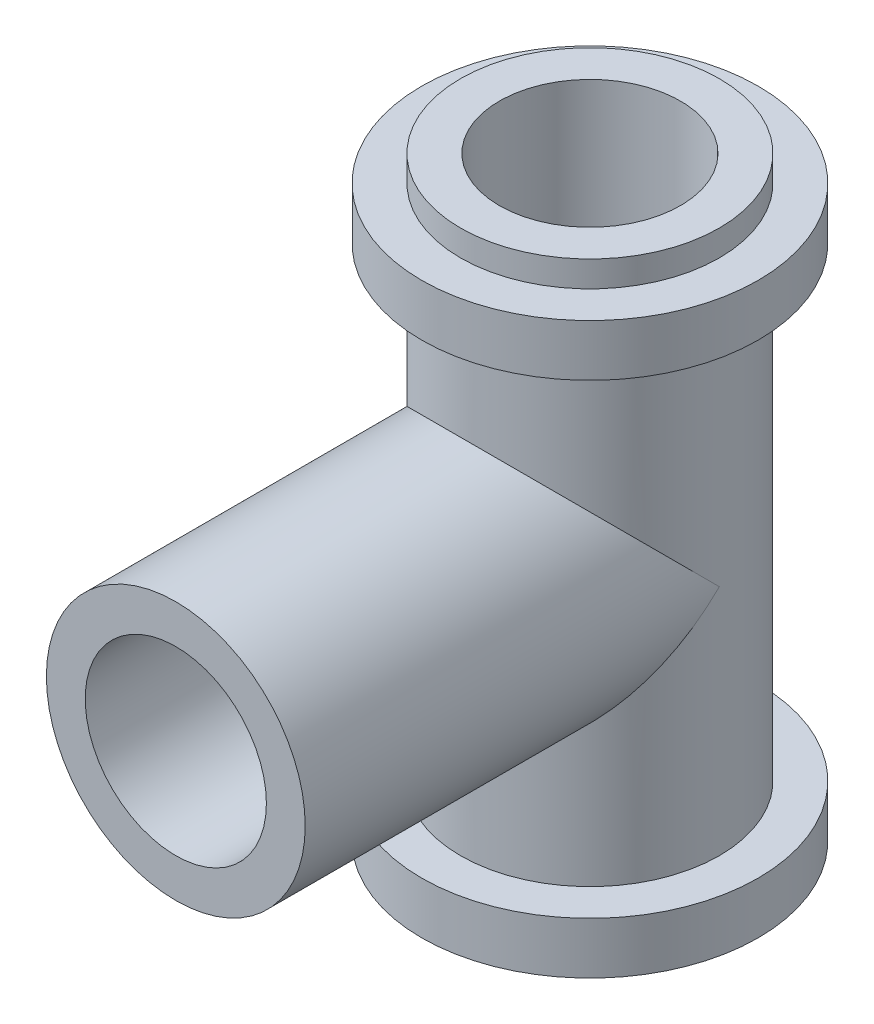
ISO-10303-21;
HEADER;
FILE_DESCRIPTION(('STEP AP214'),'2;1');
FILE_NAME('part.step','',(''),(''),'','','');
FILE_SCHEMA(('AUTOMOTIVE_DESIGN { 1 0 10303 214 1 1 1 1 }'));
ENDSEC;
DATA;
#1=APPLICATION_CONTEXT('core data for automotive mechanical design processes');
#2=APPLICATION_PROTOCOL_DEFINITION('international standard','automotive_design',2000,#1);
#3=PRODUCT_CONTEXT('',#1,'mechanical');
#4=PRODUCT('Part','Part','',(#3));
#5=PRODUCT_RELATED_PRODUCT_CATEGORY('part','',(#4));
#6=PRODUCT_DEFINITION_FORMATION('','',#4);
#7=PRODUCT_DEFINITION_CONTEXT('part definition',#1,'design');
#8=PRODUCT_DEFINITION('design','',#6,#7);
#9=PRODUCT_DEFINITION_SHAPE('','',#8);
#10=(LENGTH_UNIT() NAMED_UNIT(*) SI_UNIT(.MILLI.,.METRE.));
#11=(NAMED_UNIT(*) PLANE_ANGLE_UNIT() SI_UNIT($,.RADIAN.));
#12=(NAMED_UNIT(*) SI_UNIT($,.STERADIAN.) SOLID_ANGLE_UNIT());
#13=UNCERTAINTY_MEASURE_WITH_UNIT(LENGTH_MEASURE(1.E-05),#10,'distance_accuracy_value','');
#14=(GEOMETRIC_REPRESENTATION_CONTEXT(3) GLOBAL_UNCERTAINTY_ASSIGNED_CONTEXT((#13)) GLOBAL_UNIT_ASSIGNED_CONTEXT((#10,
#11,#12)) REPRESENTATION_CONTEXT('',''));
#15=CARTESIAN_POINT('',(0.,0.,0.));
#16=DIRECTION('',(0.,0.,1.));
#17=DIRECTION('',(1.,0.,0.));
#18=AXIS2_PLACEMENT_3D('',#15,#16,#17);
#19=CARTESIAN_POINT('',(0.,120.,0.));
#20=DIRECTION('',(0.,-1.,0.));
#21=DIRECTION('',(0.,0.,-1.));
#22=AXIS2_PLACEMENT_3D('',#19,#20,#21);
#23=CYLINDRICAL_SURFACE('',#22,25.);
#24=CARTESIAN_POINT('',(0.,60.,0.));
#25=DIRECTION('',(0.,-0.707106781186547,-0.707106781186547));
#26=DIRECTION('',(0.,-0.707106781186547,0.707106781186547));
#27=AXIS2_PLACEMENT_3D('',#24,#25,#26);
#28=ELLIPSE('',#27,35.3553390593274,25.);
#29=CARTESIAN_POINT('',(-25.,60.,0.));
#30=VERTEX_POINT('',#29);
#31=CARTESIAN_POINT('',(25.,60.,0.));
#32=VERTEX_POINT('',#31);
#33=EDGE_CURVE('E44',#30,#32,#28,.F.);
#34=ORIENTED_EDGE('',*,*,#33,.F.);
#35=CARTESIAN_POINT('',(0.,60.,0.));
#36=DIRECTION('',(0.,-0.707106781186547,0.707106781186547));
#37=DIRECTION('',(0.,-0.707106781186547,-0.707106781186547));
#38=AXIS2_PLACEMENT_3D('',#35,#36,#37);
#39=ELLIPSE('',#38,35.3553390593274,25.);
#40=EDGE_CURVE('E56',#32,#30,#39,.T.);
#41=ORIENTED_EDGE('',*,*,#40,.F.);
#42=EDGE_LOOP('',(#34,#41));
#43=FACE_BOUND('',#42,.T.);
#44=CARTESIAN_POINT('',(0.,15.,0.));
#45=DIRECTION('',(0.,-1.,0.));
#46=DIRECTION('',(0.,0.,-1.));
#47=AXIS2_PLACEMENT_3D('',#44,#45,#46);
#48=CIRCLE('',#47,25.);
#49=CARTESIAN_POINT('',(0.,15.,-25.));
#50=VERTEX_POINT('',#49);
#51=EDGE_CURVE('E49',#50,#50,#48,.T.);
#52=ORIENTED_EDGE('',*,*,#51,.F.);
#53=EDGE_LOOP('',(#52));
#54=FACE_BOUND('',#53,.T.);
#55=CARTESIAN_POINT('',(0.,105.,0.));
#56=DIRECTION('',(0.,1.,0.));
#57=DIRECTION('',(0.,0.,1.));
#58=AXIS2_PLACEMENT_3D('',#55,#56,#57);
#59=CIRCLE('',#58,25.);
#60=CARTESIAN_POINT('',(0.,105.,25.));
#61=VERTEX_POINT('',#60);
#62=EDGE_CURVE('E12',#61,#61,#59,.T.);
#63=ORIENTED_EDGE('',*,*,#62,.F.);
#64=EDGE_LOOP('',(#63));
#65=FACE_BOUND('',#64,.T.);
#66=ADVANCED_FACE('F40',(#43,#54,#65),#23,.T.);
#67=CARTESIAN_POINT('',(0.,60.,80.));
#68=DIRECTION('',(0.,0.,-1.));
#69=DIRECTION('',(-1.,0.,0.));
#70=AXIS2_PLACEMENT_3D('',#67,#68,#69);
#71=CYLINDRICAL_SURFACE('',#70,25.);
#72=CARTESIAN_POINT('',(0.,60.,80.));
#73=DIRECTION('',(0.,0.,1.));
#74=DIRECTION('',(1.,0.,0.));
#75=AXIS2_PLACEMENT_3D('',#72,#73,#74);
#76=CIRCLE('',#75,25.);
#77=CARTESIAN_POINT('',(25.,60.,80.));
#78=VERTEX_POINT('',#77);
#79=EDGE_CURVE('E71',#78,#78,#76,.T.);
#80=ORIENTED_EDGE('',*,*,#79,.F.);
#81=EDGE_LOOP('',(#80));
#82=FACE_BOUND('',#81,.T.);
#83=ORIENTED_EDGE('',*,*,#40,.T.);
#84=ORIENTED_EDGE('',*,*,#33,.T.);
#85=EDGE_LOOP('',(#83,#84));
#86=FACE_BOUND('',#85,.T.);
#87=ADVANCED_FACE('F140',(#82,#86),#71,.T.);
#88=CARTESIAN_POINT('',(0.,60.,80.));
#89=DIRECTION('',(0.,0.,1.));
#90=DIRECTION('',(1.,0.,0.));
#91=AXIS2_PLACEMENT_3D('',#88,#89,#90);
#92=PLANE('',#91);
#93=CARTESIAN_POINT('',(0.,60.,80.));
#94=DIRECTION('',(0.,0.,1.));
#95=DIRECTION('',(1.,0.,0.));
#96=AXIS2_PLACEMENT_3D('',#93,#94,#95);
#97=CIRCLE('',#96,17.5);
#98=CARTESIAN_POINT('',(17.5,60.,80.));
#99=VERTEX_POINT('',#98);
#100=EDGE_CURVE('E82',#99,#99,#97,.T.);
#101=ORIENTED_EDGE('',*,*,#100,.F.);
#102=EDGE_LOOP('',(#101));
#103=FACE_BOUND('',#102,.T.);
#104=ORIENTED_EDGE('',*,*,#79,.T.);
#105=EDGE_LOOP('',(#104));
#106=FACE_BOUND('',#105,.T.);
#107=ADVANCED_FACE('F144',(#103,#106),#92,.T.);
#108=CARTESIAN_POINT('',(0.,60.,80.));
#109=DIRECTION('',(0.,0.,-1.));
#110=DIRECTION('',(-1.,0.,0.));
#111=AXIS2_PLACEMENT_3D('',#108,#109,#110);
#112=CYLINDRICAL_SURFACE('',#111,17.5);
#113=ORIENTED_EDGE('',*,*,#100,.T.);
#114=EDGE_LOOP('',(#113));
#115=FACE_BOUND('',#114,.T.);
#116=CARTESIAN_POINT('',(0.,60.,0.));
#117=DIRECTION('',(0.,-0.707106781186547,0.707106781186547));
#118=DIRECTION('',(0.,-0.707106781186547,-0.707106781186547));
#119=AXIS2_PLACEMENT_3D('',#116,#117,#118);
#120=ELLIPSE('',#119,24.7487373415292,17.5);
#121=CARTESIAN_POINT('',(17.5,60.,0.));
#122=VERTEX_POINT('',#121);
#123=CARTESIAN_POINT('',(-17.5,60.,0.));
#124=VERTEX_POINT('',#123);
#125=EDGE_CURVE('E69',#122,#124,#120,.T.);
#126=ORIENTED_EDGE('',*,*,#125,.F.);
#127=CARTESIAN_POINT('',(0.,60.,0.));
#128=DIRECTION('',(0.,-0.707106781186547,-0.707106781186547));
#129=DIRECTION('',(0.,-0.707106781186547,0.707106781186547));
#130=AXIS2_PLACEMENT_3D('',#127,#128,#129);
#131=ELLIPSE('',#130,24.7487373415292,17.5);
#132=EDGE_CURVE('E66',#124,#122,#131,.F.);
#133=ORIENTED_EDGE('',*,*,#132,.F.);
#134=EDGE_LOOP('',(#126,#133));
#135=FACE_BOUND('',#134,.T.);
#136=ADVANCED_FACE('F68',(#115,#135),#112,.F.);
#137=CARTESIAN_POINT('',(0.,15.,0.));
#138=DIRECTION('',(0.,-1.,0.));
#139=DIRECTION('',(0.,0.,-1.));
#140=AXIS2_PLACEMENT_3D('',#137,#138,#139);
#141=CYLINDRICAL_SURFACE('',#140,32.5);
#142=CARTESIAN_POINT('',(0.,15.,0.));
#143=DIRECTION('',(0.,-1.,0.));
#144=DIRECTION('',(0.,0.,-1.));
#145=AXIS2_PLACEMENT_3D('',#142,#143,#144);
#146=CIRCLE('',#145,32.5);
#147=CARTESIAN_POINT('',(0.,15.,-32.5));
#148=VERTEX_POINT('',#147);
#149=EDGE_CURVE('E101',#148,#148,#146,.T.);
#150=ORIENTED_EDGE('',*,*,#149,.T.);
#151=EDGE_LOOP('',(#150));
#152=FACE_BOUND('',#151,.T.);
#153=CARTESIAN_POINT('',(0.,5.,0.));
#154=DIRECTION('',(0.,-1.,0.));
#155=DIRECTION('',(0.,0.,-1.));
#156=AXIS2_PLACEMENT_3D('',#153,#154,#155);
#157=CIRCLE('',#156,32.5);
#158=CARTESIAN_POINT('',(0.,5.,-32.5));
#159=VERTEX_POINT('',#158);
#160=EDGE_CURVE('E102',#159,#159,#157,.T.);
#161=ORIENTED_EDGE('',*,*,#160,.F.);
#162=EDGE_LOOP('',(#161));
#163=FACE_BOUND('',#162,.T.);
#164=ADVANCED_FACE('F167',(#152,#163),#141,.T.);
#165=CARTESIAN_POINT('',(0.,15.,0.));
#166=DIRECTION('',(0.,-1.,0.));
#167=DIRECTION('',(0.,0.,-1.));
#168=AXIS2_PLACEMENT_3D('',#165,#166,#167);
#169=PLANE('',#168);
#170=ORIENTED_EDGE('',*,*,#51,.T.);
#171=EDGE_LOOP('',(#170));
#172=FACE_BOUND('',#171,.T.);
#173=ORIENTED_EDGE('',*,*,#149,.F.);
#174=EDGE_LOOP('',(#173));
#175=FACE_BOUND('',#174,.T.);
#176=ADVANCED_FACE('F157',(#172,#175),#169,.F.);
#177=CARTESIAN_POINT('',(0.,5.,0.));
#178=DIRECTION('',(0.,-1.,0.));
#179=DIRECTION('',(0.,0.,-1.));
#180=AXIS2_PLACEMENT_3D('',#177,#178,#179);
#181=PLANE('',#180);
#182=CARTESIAN_POINT('',(0.,5.,0.));
#183=DIRECTION('',(0.,-1.,0.));
#184=DIRECTION('',(0.,0.,-1.));
#185=AXIS2_PLACEMENT_3D('',#182,#183,#184);
#186=CIRCLE('',#185,25.);
#187=CARTESIAN_POINT('',(0.,5.,-25.));
#188=VERTEX_POINT('',#187);
#189=EDGE_CURVE('E86',#188,#188,#186,.T.);
#190=ORIENTED_EDGE('',*,*,#189,.F.);
#191=EDGE_LOOP('',(#190));
#192=FACE_BOUND('',#191,.T.);
#193=ORIENTED_EDGE('',*,*,#160,.T.);
#194=EDGE_LOOP('',(#193));
#195=FACE_BOUND('',#194,.T.);
#196=ADVANCED_FACE('F150',(#192,#195),#181,.T.);
#197=ORIENTED_EDGE('',*,*,#189,.T.);
#198=EDGE_LOOP('',(#197));
#199=FACE_BOUND('',#198,.T.);
#200=CARTESIAN_POINT('',(0.,0.,0.));
#201=DIRECTION('',(0.,1.,0.));
#202=DIRECTION('',(0.,0.,1.));
#203=AXIS2_PLACEMENT_3D('',#200,#201,#202);
#204=CIRCLE('',#203,25.);
#205=CARTESIAN_POINT('',(0.,0.,25.));
#206=VERTEX_POINT('',#205);
#207=EDGE_CURVE('E89',#206,#206,#204,.T.);
#208=ORIENTED_EDGE('',*,*,#207,.T.);
#209=EDGE_LOOP('',(#208));
#210=FACE_BOUND('',#209,.T.);
#211=ADVANCED_FACE('F42',(#199,#210),#23,.T.);
#212=CARTESIAN_POINT('',(0.,0.,0.));
#213=DIRECTION('',(0.,1.,0.));
#214=DIRECTION('',(0.,0.,1.));
#215=AXIS2_PLACEMENT_3D('',#212,#213,#214);
#216=PLANE('',#215);
#217=CARTESIAN_POINT('',(0.,0.,0.));
#218=DIRECTION('',(0.,1.,0.));
#219=DIRECTION('',(0.,0.,1.));
#220=AXIS2_PLACEMENT_3D('',#217,#218,#219);
#221=CIRCLE('',#220,17.5);
#222=CARTESIAN_POINT('',(0.,0.,17.5));
#223=VERTEX_POINT('',#222);
#224=EDGE_CURVE('E77',#223,#223,#221,.T.);
#225=ORIENTED_EDGE('',*,*,#224,.T.);
#226=EDGE_LOOP('',(#225));
#227=FACE_BOUND('',#226,.T.);
#228=ORIENTED_EDGE('',*,*,#207,.F.);
#229=EDGE_LOOP('',(#228));
#230=FACE_BOUND('',#229,.T.);
#231=ADVANCED_FACE('F149',(#227,#230),#216,.F.);
#232=CARTESIAN_POINT('',(0.,120.,0.));
#233=DIRECTION('',(0.,-1.,0.));
#234=DIRECTION('',(0.,0.,-1.));
#235=AXIS2_PLACEMENT_3D('',#232,#233,#234);
#236=CYLINDRICAL_SURFACE('',#235,17.5);
#237=ORIENTED_EDGE('',*,*,#224,.F.);
#238=EDGE_LOOP('',(#237));
#239=FACE_BOUND('',#238,.T.);
#240=CARTESIAN_POINT('',(0.,120.,0.));
#241=DIRECTION('',(0.,1.,0.));
#242=DIRECTION('',(0.,0.,1.));
#243=AXIS2_PLACEMENT_3D('',#240,#241,#242);
#244=CIRCLE('',#243,17.5);
#245=CARTESIAN_POINT('',(0.,120.,17.5));
#246=VERTEX_POINT('',#245);
#247=EDGE_CURVE('E74',#246,#246,#244,.T.);
#248=ORIENTED_EDGE('',*,*,#247,.T.);
#249=EDGE_LOOP('',(#248));
#250=FACE_BOUND('',#249,.T.);
#251=ORIENTED_EDGE('',*,*,#132,.T.);
#252=ORIENTED_EDGE('',*,*,#125,.T.);
#253=EDGE_LOOP('',(#251,#252));
#254=FACE_BOUND('',#253,.T.);
#255=ADVANCED_FACE('F73',(#239,#250,#254),#236,.F.);
#256=CARTESIAN_POINT('',(0.,105.,0.));
#257=DIRECTION('',(0.,1.,0.));
#258=DIRECTION('',(0.,0.,1.));
#259=AXIS2_PLACEMENT_3D('',#256,#257,#258);
#260=CYLINDRICAL_SURFACE('',#259,32.5);
#261=CARTESIAN_POINT('',(0.,105.,0.));
#262=DIRECTION('',(0.,-1.,0.));
#263=DIRECTION('',(0.,0.,-1.));
#264=AXIS2_PLACEMENT_3D('',#261,#262,#263);
#265=CIRCLE('',#264,32.5);
#266=CARTESIAN_POINT('',(0.,105.,-32.5));
#267=VERTEX_POINT('',#266);
#268=EDGE_CURVE('E110',#267,#267,#265,.T.);
#269=ORIENTED_EDGE('',*,*,#268,.F.);
#270=EDGE_LOOP('',(#269));
#271=FACE_BOUND('',#270,.T.);
#272=CARTESIAN_POINT('',(0.,115.,0.));
#273=DIRECTION('',(0.,-1.,0.));
#274=DIRECTION('',(0.,0.,-1.));
#275=AXIS2_PLACEMENT_3D('',#272,#273,#274);
#276=CIRCLE('',#275,32.5);
#277=CARTESIAN_POINT('',(0.,115.,-32.5));
#278=VERTEX_POINT('',#277);
#279=EDGE_CURVE('E111',#278,#278,#276,.T.);
#280=ORIENTED_EDGE('',*,*,#279,.T.);
#281=EDGE_LOOP('',(#280));
#282=FACE_BOUND('',#281,.T.);
#283=ADVANCED_FACE('F119',(#271,#282),#260,.T.);
#284=CARTESIAN_POINT('',(0.,105.,0.));
#285=DIRECTION('',(0.,1.,0.));
#286=DIRECTION('',(0.,0.,-1.));
#287=AXIS2_PLACEMENT_3D('',#284,#285,#286);
#288=PLANE('',#287);
#289=ORIENTED_EDGE('',*,*,#62,.T.);
#290=EDGE_LOOP('',(#289));
#291=FACE_BOUND('',#290,.T.);
#292=ORIENTED_EDGE('',*,*,#268,.T.);
#293=EDGE_LOOP('',(#292));
#294=FACE_BOUND('',#293,.T.);
#295=ADVANCED_FACE('F117',(#291,#294),#288,.F.);
#296=CARTESIAN_POINT('',(0.,115.,0.));
#297=DIRECTION('',(0.,1.,0.));
#298=DIRECTION('',(0.,0.,-1.));
#299=AXIS2_PLACEMENT_3D('',#296,#297,#298);
#300=PLANE('',#299);
#301=CARTESIAN_POINT('',(0.,115.,0.));
#302=DIRECTION('',(0.,1.,0.));
#303=DIRECTION('',(0.,0.,1.));
#304=AXIS2_PLACEMENT_3D('',#301,#302,#303);
#305=CIRCLE('',#304,25.);
#306=CARTESIAN_POINT('',(0.,115.,25.));
#307=VERTEX_POINT('',#306);
#308=EDGE_CURVE('E105',#307,#307,#305,.T.);
#309=ORIENTED_EDGE('',*,*,#308,.F.);
#310=EDGE_LOOP('',(#309));
#311=FACE_BOUND('',#310,.T.);
#312=ORIENTED_EDGE('',*,*,#279,.F.);
#313=EDGE_LOOP('',(#312));
#314=FACE_BOUND('',#313,.T.);
#315=ADVANCED_FACE('F125',(#311,#314),#300,.T.);
#316=ORIENTED_EDGE('',*,*,#308,.T.);
#317=EDGE_LOOP('',(#316));
#318=FACE_BOUND('',#317,.T.);
#319=CARTESIAN_POINT('',(0.,120.,0.));
#320=DIRECTION('',(0.,1.,0.));
#321=DIRECTION('',(0.,0.,1.));
#322=AXIS2_PLACEMENT_3D('',#319,#320,#321);
#323=CIRCLE('',#322,25.);
#324=CARTESIAN_POINT('',(0.,120.,25.));
#325=VERTEX_POINT('',#324);
#326=EDGE_CURVE('E90',#325,#325,#323,.T.);
#327=ORIENTED_EDGE('',*,*,#326,.F.);
#328=EDGE_LOOP('',(#327));
#329=FACE_BOUND('',#328,.T.);
#330=ADVANCED_FACE('F127',(#318,#329),#23,.T.);
#331=CARTESIAN_POINT('',(0.,120.,0.));
#332=DIRECTION('',(0.,1.,0.));
#333=DIRECTION('',(0.,0.,1.));
#334=AXIS2_PLACEMENT_3D('',#331,#332,#333);
#335=PLANE('',#334);
#336=ORIENTED_EDGE('',*,*,#247,.F.);
#337=EDGE_LOOP('',(#336));
#338=FACE_BOUND('',#337,.T.);
#339=ORIENTED_EDGE('',*,*,#326,.T.);
#340=EDGE_LOOP('',(#339));
#341=FACE_BOUND('',#340,.T.);
#342=ADVANCED_FACE('F134',(#338,#341),#335,.T.);
#343=CLOSED_SHELL('',(#66,#87,#107,#136,#164,#176,#196,#211,#231,#255,#283,#295,#315,#330,#342));
#344=MANIFOLD_SOLID_BREP('B2',#343);
#345=ADVANCED_BREP_SHAPE_REPRESENTATION('',(#18,#344),#14);
#346=SHAPE_DEFINITION_REPRESENTATION(#9,#345);
ENDSEC;
END-ISO-10303-21;
